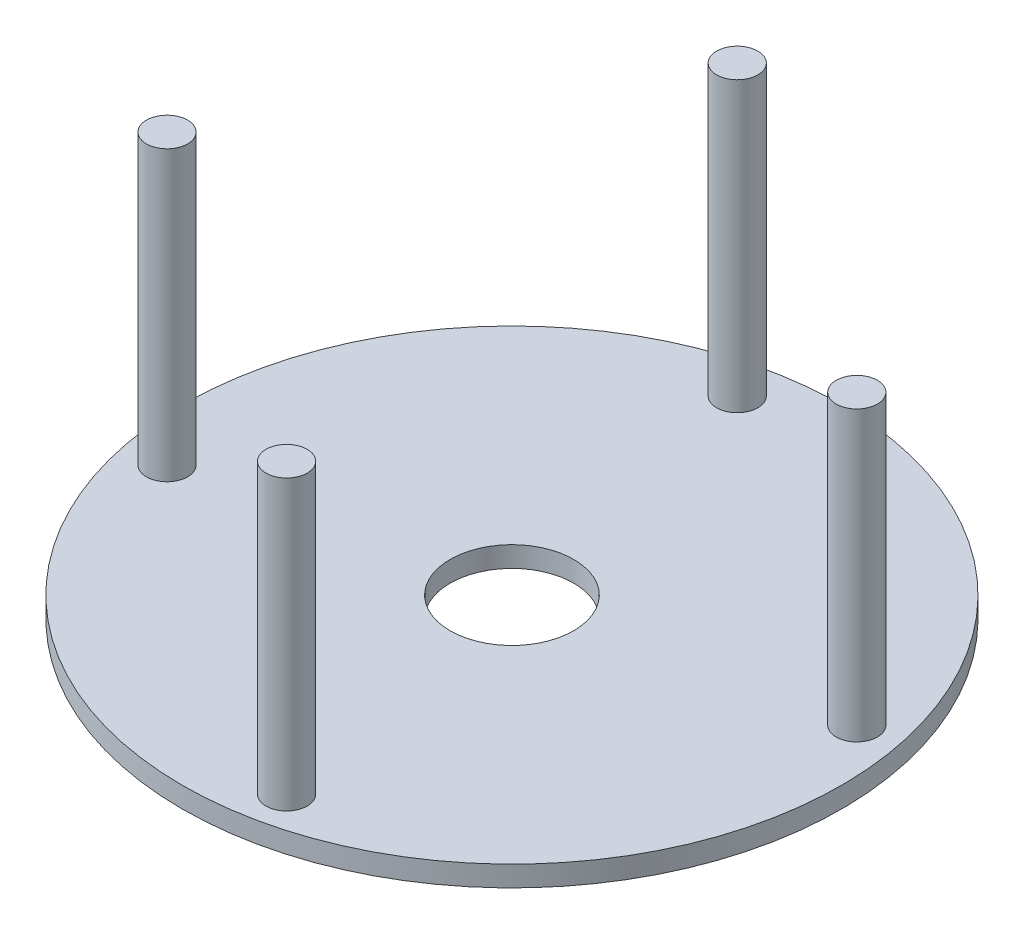
ISO-10303-21;
HEADER;
FILE_DESCRIPTION(('STEP AP214'),'2;1');
FILE_NAME('part.step','',(''),(''),'','','');
FILE_SCHEMA(('AUTOMOTIVE_DESIGN { 1 0 10303 214 1 1 1 1 }'));
ENDSEC;
DATA;
#1=APPLICATION_CONTEXT('core data for automotive mechanical design processes');
#2=APPLICATION_PROTOCOL_DEFINITION('international standard','automotive_design',2000,#1);
#3=PRODUCT_CONTEXT('',#1,'mechanical');
#4=PRODUCT('Part','Part','',(#3));
#5=PRODUCT_RELATED_PRODUCT_CATEGORY('part','',(#4));
#6=PRODUCT_DEFINITION_FORMATION('','',#4);
#7=PRODUCT_DEFINITION_CONTEXT('part definition',#1,'design');
#8=PRODUCT_DEFINITION('design','',#6,#7);
#9=PRODUCT_DEFINITION_SHAPE('','',#8);
#10=(LENGTH_UNIT() NAMED_UNIT(*) SI_UNIT(.MILLI.,.METRE.));
#11=(NAMED_UNIT(*) PLANE_ANGLE_UNIT() SI_UNIT($,.RADIAN.));
#12=(NAMED_UNIT(*) SI_UNIT($,.STERADIAN.) SOLID_ANGLE_UNIT());
#13=UNCERTAINTY_MEASURE_WITH_UNIT(LENGTH_MEASURE(1.E-05),#10,'distance_accuracy_value','');
#14=(GEOMETRIC_REPRESENTATION_CONTEXT(3) GLOBAL_UNCERTAINTY_ASSIGNED_CONTEXT((#13)) GLOBAL_UNIT_ASSIGNED_CONTEXT((#10,
#11,#12)) REPRESENTATION_CONTEXT('',''));
#15=CARTESIAN_POINT('',(0.,0.,0.));
#16=DIRECTION('',(0.,0.,1.));
#17=DIRECTION('',(1.,0.,0.));
#18=AXIS2_PLACEMENT_3D('',#15,#16,#17);
#19=CARTESIAN_POINT('',(0.,3.175,0.));
#20=DIRECTION('',(0.,1.,0.));
#21=DIRECTION('',(0.,0.,1.));
#22=AXIS2_PLACEMENT_3D('',#19,#20,#21);
#23=PLANE('',#22);
#24=CARTESIAN_POINT('',(9.21464266183947,3.175,43.9455954631929));
#25=DIRECTION('',(0.,1.,0.));
#26=DIRECTION('',(0.,0.,1.));
#27=AXIS2_PLACEMENT_3D('',#24,#25,#26);
#28=CIRCLE('',#27,3.175);
#29=CARTESIAN_POINT('',(9.21464266183947,3.175,47.1205954631929));
#30=VERTEX_POINT('',#29);
#31=EDGE_CURVE('E65',#30,#30,#28,.T.);
#32=ORIENTED_EDGE('',*,*,#31,.F.);
#33=EDGE_LOOP('',(#32));
#34=FACE_BOUND('',#33,.T.);
#35=CARTESIAN_POINT('',(-9.21464266183987,3.175,-43.945595463193));
#36=DIRECTION('',(0.,1.,0.));
#37=DIRECTION('',(0.,0.,1.));
#38=AXIS2_PLACEMENT_3D('',#35,#36,#37);
#39=CIRCLE('',#38,3.175);
#40=CARTESIAN_POINT('',(-9.21464266183987,3.175,-40.770595463193));
#41=VERTEX_POINT('',#40);
#42=EDGE_CURVE('E56',#41,#41,#39,.T.);
#43=ORIENTED_EDGE('',*,*,#42,.F.);
#44=EDGE_LOOP('',(#43));
#45=FACE_BOUND('',#44,.T.);
#46=CARTESIAN_POINT('',(0.,3.175,0.));
#47=DIRECTION('',(0.,1.,0.));
#48=DIRECTION('',(0.,0.,1.));
#49=AXIS2_PLACEMENT_3D('',#46,#47,#48);
#50=CIRCLE('',#49,50.8);
#51=CARTESIAN_POINT('',(0.,3.175,50.8));
#52=VERTEX_POINT('',#51);
#53=EDGE_CURVE('E11',#52,#52,#50,.T.);
#54=ORIENTED_EDGE('',*,*,#53,.T.);
#55=EDGE_LOOP('',(#54));
#56=FACE_BOUND('',#55,.T.);
#57=CARTESIAN_POINT('',(0.,3.175,0.));
#58=DIRECTION('',(0.,1.,0.));
#59=DIRECTION('',(0.,0.,1.));
#60=AXIS2_PLACEMENT_3D('',#57,#58,#59);
#61=CIRCLE('',#60,9.525);
#62=CARTESIAN_POINT('',(0.,3.175,9.525));
#63=VERTEX_POINT('',#62);
#64=EDGE_CURVE('E48',#63,#63,#61,.T.);
#65=ORIENTED_EDGE('',*,*,#64,.F.);
#66=EDGE_LOOP('',(#65));
#67=FACE_BOUND('',#66,.T.);
#68=CARTESIAN_POINT('',(43.9455954631928,3.175,-9.2146426618397));
#69=DIRECTION('',(0.,1.,0.));
#70=DIRECTION('',(0.,0.,1.));
#71=AXIS2_PLACEMENT_3D('',#68,#69,#70);
#72=CIRCLE('',#71,3.175);
#73=CARTESIAN_POINT('',(43.9455954631928,3.175,-6.0396426618397));
#74=VERTEX_POINT('',#73);
#75=EDGE_CURVE('E59',#74,#74,#72,.T.);
#76=ORIENTED_EDGE('',*,*,#75,.F.);
#77=EDGE_LOOP('',(#76));
#78=FACE_BOUND('',#77,.T.);
#79=CARTESIAN_POINT('',(-43.9455954631932,3.175,9.21464266183964));
#80=DIRECTION('',(0.,1.,0.));
#81=DIRECTION('',(0.,0.,1.));
#82=AXIS2_PLACEMENT_3D('',#79,#80,#81);
#83=CIRCLE('',#82,3.175);
#84=CARTESIAN_POINT('',(-43.9455954631932,3.175,12.3896426618396));
#85=VERTEX_POINT('',#84);
#86=EDGE_CURVE('E71',#85,#85,#83,.T.);
#87=ORIENTED_EDGE('',*,*,#86,.F.);
#88=EDGE_LOOP('',(#87));
#89=FACE_BOUND('',#88,.T.);
#90=ADVANCED_FACE('F37',(#34,#45,#56,#67,#78,#89),#23,.T.);
#91=CARTESIAN_POINT('',(0.,0.,0.));
#92=DIRECTION('',(0.,1.,0.));
#93=DIRECTION('',(0.,0.,1.));
#94=AXIS2_PLACEMENT_3D('',#91,#92,#93);
#95=PLANE('',#94);
#96=CARTESIAN_POINT('',(0.,0.,0.));
#97=DIRECTION('',(0.,1.,0.));
#98=DIRECTION('',(0.,0.,1.));
#99=AXIS2_PLACEMENT_3D('',#96,#97,#98);
#100=CIRCLE('',#99,50.8);
#101=CARTESIAN_POINT('',(0.,0.,50.8));
#102=VERTEX_POINT('',#101);
#103=EDGE_CURVE('E41',#102,#102,#100,.T.);
#104=ORIENTED_EDGE('',*,*,#103,.F.);
#105=EDGE_LOOP('',(#104));
#106=FACE_BOUND('',#105,.T.);
#107=CARTESIAN_POINT('',(0.,0.,0.));
#108=DIRECTION('',(0.,1.,0.));
#109=DIRECTION('',(0.,0.,1.));
#110=AXIS2_PLACEMENT_3D('',#107,#108,#109);
#111=CIRCLE('',#110,9.525);
#112=CARTESIAN_POINT('',(0.,0.,9.525));
#113=VERTEX_POINT('',#112);
#114=EDGE_CURVE('E50',#113,#113,#111,.T.);
#115=ORIENTED_EDGE('',*,*,#114,.T.);
#116=EDGE_LOOP('',(#115));
#117=FACE_BOUND('',#116,.T.);
#118=ADVANCED_FACE('F83',(#106,#117),#95,.F.);
#119=CARTESIAN_POINT('',(0.,3.175,0.));
#120=DIRECTION('',(0.,-1.,0.));
#121=DIRECTION('',(0.,0.,-1.));
#122=AXIS2_PLACEMENT_3D('',#119,#120,#121);
#123=CYLINDRICAL_SURFACE('',#122,50.8);
#124=ORIENTED_EDGE('',*,*,#53,.F.);
#125=EDGE_LOOP('',(#124));
#126=FACE_BOUND('',#125,.T.);
#127=ORIENTED_EDGE('',*,*,#103,.T.);
#128=EDGE_LOOP('',(#127));
#129=FACE_BOUND('',#128,.T.);
#130=ADVANCED_FACE('F39',(#126,#129),#123,.T.);
#131=CARTESIAN_POINT('',(0.,3.175,0.));
#132=DIRECTION('',(0.,-1.,0.));
#133=DIRECTION('',(0.,0.,-1.));
#134=AXIS2_PLACEMENT_3D('',#131,#132,#133);
#135=CYLINDRICAL_SURFACE('',#134,9.525);
#136=ORIENTED_EDGE('',*,*,#64,.T.);
#137=EDGE_LOOP('',(#136));
#138=FACE_BOUND('',#137,.T.);
#139=ORIENTED_EDGE('',*,*,#114,.F.);
#140=EDGE_LOOP('',(#139));
#141=FACE_BOUND('',#140,.T.);
#142=ADVANCED_FACE('F95',(#138,#141),#135,.F.);
#143=CARTESIAN_POINT('',(-9.21464266183987,47.625,-43.945595463193));
#144=DIRECTION('',(0.,-1.,0.));
#145=DIRECTION('',(0.,0.,-1.));
#146=AXIS2_PLACEMENT_3D('',#143,#144,#145);
#147=CYLINDRICAL_SURFACE('',#146,3.175);
#148=CARTESIAN_POINT('',(-9.21464266183987,47.625,-43.945595463193));
#149=DIRECTION('',(0.,1.,0.));
#150=DIRECTION('',(0.,0.,1.));
#151=AXIS2_PLACEMENT_3D('',#148,#149,#150);
#152=CIRCLE('',#151,3.175);
#153=CARTESIAN_POINT('',(-9.21464266183987,47.625,-40.770595463193));
#154=VERTEX_POINT('',#153);
#155=EDGE_CURVE('E53',#154,#154,#152,.T.);
#156=ORIENTED_EDGE('',*,*,#155,.F.);
#157=EDGE_LOOP('',(#156));
#158=FACE_BOUND('',#157,.T.);
#159=ORIENTED_EDGE('',*,*,#42,.T.);
#160=EDGE_LOOP('',(#159));
#161=FACE_BOUND('',#160,.T.);
#162=ADVANCED_FACE('F98',(#158,#161),#147,.T.);
#163=CARTESIAN_POINT('',(-9.21464266183987,47.625,-43.945595463193));
#164=DIRECTION('',(0.,1.,0.));
#165=DIRECTION('',(0.,0.,1.));
#166=AXIS2_PLACEMENT_3D('',#163,#164,#165);
#167=PLANE('',#166);
#168=ORIENTED_EDGE('',*,*,#155,.T.);
#169=EDGE_LOOP('',(#168));
#170=FACE_BOUND('',#169,.T.);
#171=ADVANCED_FACE('F102',(#170),#167,.T.);
#172=CARTESIAN_POINT('',(43.9455954631928,47.625,-9.2146426618397));
#173=DIRECTION('',(0.,-1.,0.));
#174=DIRECTION('',(0.,0.,-1.));
#175=AXIS2_PLACEMENT_3D('',#172,#173,#174);
#176=CYLINDRICAL_SURFACE('',#175,3.175);
#177=CARTESIAN_POINT('',(43.9455954631928,47.625,-9.2146426618397));
#178=DIRECTION('',(0.,1.,0.));
#179=DIRECTION('',(0.,0.,1.));
#180=AXIS2_PLACEMENT_3D('',#177,#178,#179);
#181=CIRCLE('',#180,3.175);
#182=CARTESIAN_POINT('',(43.9455954631928,47.625,-6.0396426618397));
#183=VERTEX_POINT('',#182);
#184=EDGE_CURVE('E62',#183,#183,#181,.T.);
#185=ORIENTED_EDGE('',*,*,#184,.F.);
#186=EDGE_LOOP('',(#185));
#187=FACE_BOUND('',#186,.T.);
#188=ORIENTED_EDGE('',*,*,#75,.T.);
#189=EDGE_LOOP('',(#188));
#190=FACE_BOUND('',#189,.T.);
#191=ADVANCED_FACE('F106',(#187,#190),#176,.T.);
#192=CARTESIAN_POINT('',(43.9455954631928,47.625,-9.2146426618397));
#193=DIRECTION('',(0.,1.,0.));
#194=DIRECTION('',(0.,0.,1.));
#195=AXIS2_PLACEMENT_3D('',#192,#193,#194);
#196=PLANE('',#195);
#197=ORIENTED_EDGE('',*,*,#184,.T.);
#198=EDGE_LOOP('',(#197));
#199=FACE_BOUND('',#198,.T.);
#200=ADVANCED_FACE('F108',(#199),#196,.T.);
#201=CARTESIAN_POINT('',(9.21464266183947,47.625,43.9455954631929));
#202=DIRECTION('',(0.,-1.,0.));
#203=DIRECTION('',(0.,0.,-1.));
#204=AXIS2_PLACEMENT_3D('',#201,#202,#203);
#205=CYLINDRICAL_SURFACE('',#204,3.175);
#206=CARTESIAN_POINT('',(9.21464266183947,47.625,43.9455954631929));
#207=DIRECTION('',(0.,1.,0.));
#208=DIRECTION('',(0.,0.,1.));
#209=AXIS2_PLACEMENT_3D('',#206,#207,#208);
#210=CIRCLE('',#209,3.175);
#211=CARTESIAN_POINT('',(9.21464266183947,47.625,47.1205954631929));
#212=VERTEX_POINT('',#211);
#213=EDGE_CURVE('E68',#212,#212,#210,.T.);
#214=ORIENTED_EDGE('',*,*,#213,.F.);
#215=EDGE_LOOP('',(#214));
#216=FACE_BOUND('',#215,.T.);
#217=ORIENTED_EDGE('',*,*,#31,.T.);
#218=EDGE_LOOP('',(#217));
#219=FACE_BOUND('',#218,.T.);
#220=ADVANCED_FACE('F111',(#216,#219),#205,.T.);
#221=CARTESIAN_POINT('',(9.21464266183947,47.625,43.9455954631929));
#222=DIRECTION('',(0.,1.,0.));
#223=DIRECTION('',(0.,0.,1.));
#224=AXIS2_PLACEMENT_3D('',#221,#222,#223);
#225=PLANE('',#224);
#226=ORIENTED_EDGE('',*,*,#213,.T.);
#227=EDGE_LOOP('',(#226));
#228=FACE_BOUND('',#227,.T.);
#229=ADVANCED_FACE('F116',(#228),#225,.T.);
#230=CARTESIAN_POINT('',(-43.9455954631932,47.625,9.21464266183964));
#231=DIRECTION('',(0.,-1.,0.));
#232=DIRECTION('',(0.,0.,-1.));
#233=AXIS2_PLACEMENT_3D('',#230,#231,#232);
#234=CYLINDRICAL_SURFACE('',#233,3.175);
#235=CARTESIAN_POINT('',(-43.9455954631932,47.625,9.21464266183964));
#236=DIRECTION('',(0.,1.,0.));
#237=DIRECTION('',(0.,0.,1.));
#238=AXIS2_PLACEMENT_3D('',#235,#236,#237);
#239=CIRCLE('',#238,3.175);
#240=CARTESIAN_POINT('',(-43.9455954631932,47.625,12.3896426618396));
#241=VERTEX_POINT('',#240);
#242=EDGE_CURVE('E74',#241,#241,#239,.T.);
#243=ORIENTED_EDGE('',*,*,#242,.F.);
#244=EDGE_LOOP('',(#243));
#245=FACE_BOUND('',#244,.T.);
#246=ORIENTED_EDGE('',*,*,#86,.T.);
#247=EDGE_LOOP('',(#246));
#248=FACE_BOUND('',#247,.T.);
#249=ADVANCED_FACE('F80',(#245,#248),#234,.T.);
#250=CARTESIAN_POINT('',(-43.9455954631932,47.625,9.21464266183964));
#251=DIRECTION('',(0.,1.,0.));
#252=DIRECTION('',(0.,0.,1.));
#253=AXIS2_PLACEMENT_3D('',#250,#251,#252);
#254=PLANE('',#253);
#255=ORIENTED_EDGE('',*,*,#242,.T.);
#256=EDGE_LOOP('',(#255));
#257=FACE_BOUND('',#256,.T.);
#258=ADVANCED_FACE('F123',(#257),#254,.T.);
#259=CLOSED_SHELL('',(#90,#118,#130,#142,#162,#171,#191,#200,#220,#229,#249,#258));
#260=MANIFOLD_SOLID_BREP('B2',#259);
#261=ADVANCED_BREP_SHAPE_REPRESENTATION('',(#18,#260),#14);
#262=SHAPE_DEFINITION_REPRESENTATION(#9,#261);
ENDSEC;
END-ISO-10303-21;
